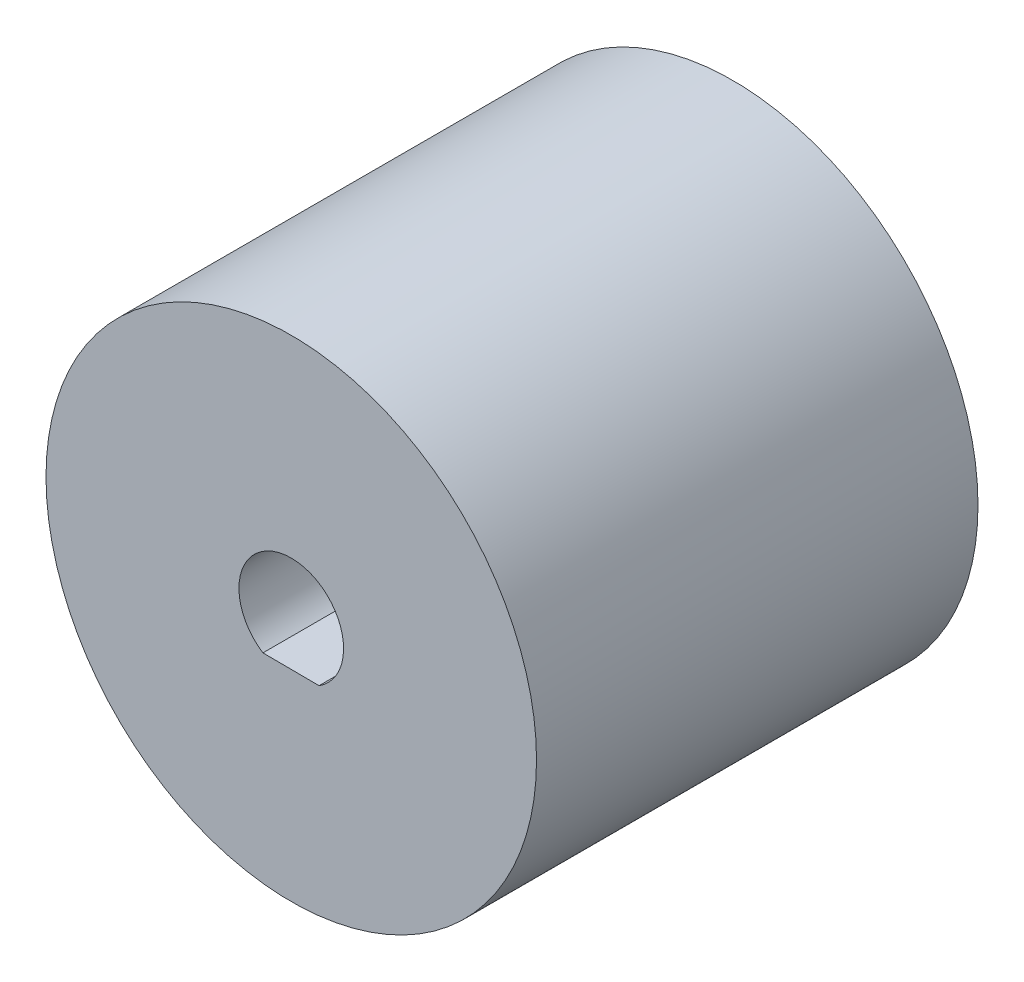
ISO-10303-21;
HEADER;
FILE_DESCRIPTION(('STEP AP214'),'2;1');
FILE_NAME('part.step','',(''),(''),'','','');
FILE_SCHEMA(('AUTOMOTIVE_DESIGN { 1 0 10303 214 1 1 1 1 }'));
ENDSEC;
DATA;
#1=APPLICATION_CONTEXT('core data for automotive mechanical design processes');
#2=APPLICATION_PROTOCOL_DEFINITION('international standard','automotive_design',2000,#1);
#3=PRODUCT_CONTEXT('',#1,'mechanical');
#4=PRODUCT('Part','Part','',(#3));
#5=PRODUCT_RELATED_PRODUCT_CATEGORY('part','',(#4));
#6=PRODUCT_DEFINITION_FORMATION('','',#4);
#7=PRODUCT_DEFINITION_CONTEXT('part definition',#1,'design');
#8=PRODUCT_DEFINITION('design','',#6,#7);
#9=PRODUCT_DEFINITION_SHAPE('','',#8);
#10=(LENGTH_UNIT() NAMED_UNIT(*) SI_UNIT(.MILLI.,.METRE.));
#11=(NAMED_UNIT(*) PLANE_ANGLE_UNIT() SI_UNIT($,.RADIAN.));
#12=(NAMED_UNIT(*) SI_UNIT($,.STERADIAN.) SOLID_ANGLE_UNIT());
#13=UNCERTAINTY_MEASURE_WITH_UNIT(LENGTH_MEASURE(1.E-05),#10,'distance_accuracy_value','');
#14=(GEOMETRIC_REPRESENTATION_CONTEXT(3) GLOBAL_UNCERTAINTY_ASSIGNED_CONTEXT((#13)) GLOBAL_UNIT_ASSIGNED_CONTEXT((#10,
#11,#12)) REPRESENTATION_CONTEXT('',''));
#15=CARTESIAN_POINT('',(0.,0.,0.));
#16=DIRECTION('',(0.,0.,1.));
#17=DIRECTION('',(1.,0.,0.));
#18=AXIS2_PLACEMENT_3D('',#15,#16,#17);
#19=CARTESIAN_POINT('',(0.,0.,27.));
#20=DIRECTION('',(0.,0.,1.));
#21=DIRECTION('',(1.,0.,0.));
#22=AXIS2_PLACEMENT_3D('',#19,#20,#21);
#23=PLANE('',#22);
#24=CARTESIAN_POINT('',(0.,0.,27.));
#25=DIRECTION('',(0.,0.,1.));
#26=DIRECTION('',(1.,0.,0.));
#27=AXIS2_PLACEMENT_3D('',#24,#25,#26);
#28=CIRCLE('',#27,15.);
#29=CARTESIAN_POINT('',(15.,0.,27.));
#30=VERTEX_POINT('',#29);
#31=EDGE_CURVE('E11',#30,#30,#28,.T.);
#32=ORIENTED_EDGE('',*,*,#31,.T.);
#33=EDGE_LOOP('',(#32));
#34=FACE_BOUND('',#33,.T.);
#35=DIRECTION('',(0.999982911664881,-0.00584605663903914,0.));
#36=VECTOR('',#35,1.);
#37=CARTESIAN_POINT('',(-1.7333114064778,-2.68991292947818,27.));
#38=LINE('',#37,#36);
#39=CARTESIAN_POINT('',(-1.7333114064778,-2.68991292947818,27.));
#40=VERTEX_POINT('',#39);
#41=CARTESIAN_POINT('',(1.70174270062693,-2.7099947935121,27.));
#42=VERTEX_POINT('',#41);
#43=EDGE_CURVE('E84',#40,#42,#38,.T.);
#44=ORIENTED_EDGE('',*,*,#43,.F.);
#45=CARTESIAN_POINT('',(0.,0.,27.));
#46=DIRECTION('',(0.,0.,1.));
#47=DIRECTION('',(1.,0.,0.));
#48=AXIS2_PLACEMENT_3D('',#45,#46,#47);
#49=CIRCLE('',#48,3.20000000000001);
#50=EDGE_CURVE('E73',#42,#40,#49,.T.);
#51=ORIENTED_EDGE('',*,*,#50,.F.);
#52=EDGE_LOOP('',(#44,#51));
#53=FACE_BOUND('',#52,.T.);
#54=ADVANCED_FACE('F39',(#34,#53),#23,.T.);
#55=CARTESIAN_POINT('',(0.,0.,0.));
#56=DIRECTION('',(0.,0.,1.));
#57=DIRECTION('',(1.,0.,0.));
#58=AXIS2_PLACEMENT_3D('',#55,#56,#57);
#59=PLANE('',#58);
#60=CARTESIAN_POINT('',(0.,0.,0.));
#61=DIRECTION('',(0.,0.,1.));
#62=DIRECTION('',(1.,0.,0.));
#63=AXIS2_PLACEMENT_3D('',#60,#61,#62);
#64=CIRCLE('',#63,15.);
#65=CARTESIAN_POINT('',(15.,0.,0.));
#66=VERTEX_POINT('',#65);
#67=EDGE_CURVE('E43',#66,#66,#64,.T.);
#68=ORIENTED_EDGE('',*,*,#67,.F.);
#69=EDGE_LOOP('',(#68));
#70=FACE_BOUND('',#69,.T.);
#71=CARTESIAN_POINT('',(0.,0.,0.));
#72=DIRECTION('',(0.,0.,1.));
#73=DIRECTION('',(1.,0.,0.));
#74=AXIS2_PLACEMENT_3D('',#71,#72,#73);
#75=CIRCLE('',#74,3.20000000000001);
#76=CARTESIAN_POINT('',(1.70174270062693,-2.7099947935121,0.));
#77=VERTEX_POINT('',#76);
#78=CARTESIAN_POINT('',(-1.7333114064778,-2.68991292947818,0.));
#79=VERTEX_POINT('',#78);
#80=EDGE_CURVE('E62',#77,#79,#75,.T.);
#81=ORIENTED_EDGE('',*,*,#80,.T.);
#82=DIRECTION('',(0.999982911664881,-0.00584605663903914,0.));
#83=VECTOR('',#82,1.);
#84=CARTESIAN_POINT('',(-1.7333114064778,-2.68991292947818,0.));
#85=LINE('',#84,#83);
#86=EDGE_CURVE('E68',#79,#77,#85,.T.);
#87=ORIENTED_EDGE('',*,*,#86,.T.);
#88=EDGE_LOOP('',(#81,#87));
#89=FACE_BOUND('',#88,.T.);
#90=ADVANCED_FACE('F80',(#70,#89),#59,.F.);
#91=CARTESIAN_POINT('',(0.,0.,27.));
#92=DIRECTION('',(0.,0.,-1.));
#93=DIRECTION('',(-1.,0.,0.));
#94=AXIS2_PLACEMENT_3D('',#91,#92,#93);
#95=CYLINDRICAL_SURFACE('',#94,15.);
#96=ORIENTED_EDGE('',*,*,#31,.F.);
#97=EDGE_LOOP('',(#96));
#98=FACE_BOUND('',#97,.T.);
#99=ORIENTED_EDGE('',*,*,#67,.T.);
#100=EDGE_LOOP('',(#99));
#101=FACE_BOUND('',#100,.T.);
#102=ADVANCED_FACE('F41',(#98,#101),#95,.T.);
#103=CARTESIAN_POINT('',(0.,0.,27.));
#104=DIRECTION('',(0.,0.,-1.));
#105=DIRECTION('',(-1.,0.,0.));
#106=AXIS2_PLACEMENT_3D('',#103,#104,#105);
#107=CYLINDRICAL_SURFACE('',#106,3.20000000000001);
#108=ORIENTED_EDGE('',*,*,#80,.F.);
#109=DIRECTION('',(0.,0.,-1.));
#110=VECTOR('',#109,1.);
#111=CARTESIAN_POINT('',(1.70174270062693,-2.7099947935121,27.));
#112=LINE('',#111,#110);
#113=EDGE_CURVE('E70',#42,#77,#112,.T.);
#114=ORIENTED_EDGE('',*,*,#113,.F.);
#115=ORIENTED_EDGE('',*,*,#50,.T.);
#116=DIRECTION('',(0.,0.,-1.));
#117=VECTOR('',#116,1.);
#118=CARTESIAN_POINT('',(-1.7333114064778,-2.68991292947818,27.));
#119=LINE('',#118,#117);
#120=EDGE_CURVE('E55',#40,#79,#119,.T.);
#121=ORIENTED_EDGE('',*,*,#120,.T.);
#122=EDGE_LOOP('',(#108,#114,#115,#121));
#123=FACE_BOUND('',#122,.T.);
#124=ADVANCED_FACE('F75',(#123),#107,.F.);
#125=CARTESIAN_POINT('',(-1.7333114064778,-2.68991292947818,27.));
#126=DIRECTION('',(0.00584605663903914,0.999982911664881,0.));
#127=DIRECTION('',(-0.999982911664881,0.00584605663903914,0.));
#128=AXIS2_PLACEMENT_3D('',#125,#126,#127);
#129=PLANE('',#128);
#130=ORIENTED_EDGE('',*,*,#86,.F.);
#131=ORIENTED_EDGE('',*,*,#120,.F.);
#132=ORIENTED_EDGE('',*,*,#43,.T.);
#133=ORIENTED_EDGE('',*,*,#113,.T.);
#134=EDGE_LOOP('',(#130,#131,#132,#133));
#135=FACE_BOUND('',#134,.T.);
#136=ADVANCED_FACE('F69',(#135),#129,.T.);
#137=CLOSED_SHELL('',(#54,#90,#102,#124,#136));
#138=MANIFOLD_SOLID_BREP('B2',#137);
#139=ADVANCED_BREP_SHAPE_REPRESENTATION('',(#18,#138),#14);
#140=SHAPE_DEFINITION_REPRESENTATION(#9,#139);
ENDSEC;
END-ISO-10303-21;
